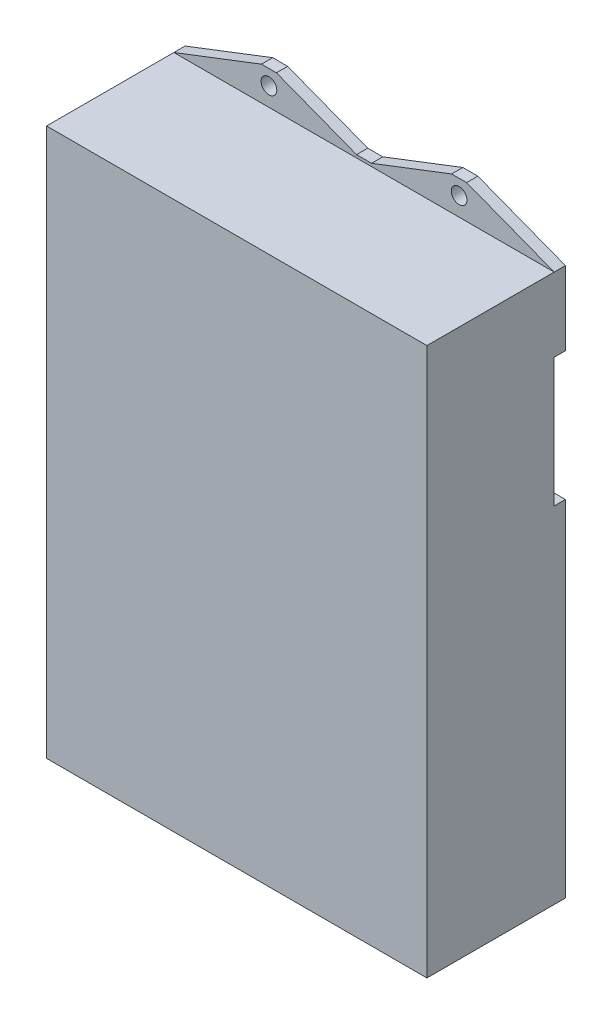
ISO-10303-21;
HEADER;
FILE_DESCRIPTION(('STEP AP214'),'2;1');
FILE_NAME('part.step','',(''),(''),'','','');
FILE_SCHEMA(('AUTOMOTIVE_DESIGN { 1 0 10303 214 1 1 1 1 }'));
ENDSEC;
DATA;
#1=APPLICATION_CONTEXT('core data for automotive mechanical design processes');
#2=APPLICATION_PROTOCOL_DEFINITION('international standard','automotive_design',2000,#1);
#3=PRODUCT_CONTEXT('',#1,'mechanical');
#4=PRODUCT('Part','Part','',(#3));
#5=PRODUCT_RELATED_PRODUCT_CATEGORY('part','',(#4));
#6=PRODUCT_DEFINITION_FORMATION('','',#4);
#7=PRODUCT_DEFINITION_CONTEXT('part definition',#1,'design');
#8=PRODUCT_DEFINITION('design','',#6,#7);
#9=PRODUCT_DEFINITION_SHAPE('','',#8);
#10=(LENGTH_UNIT() NAMED_UNIT(*) SI_UNIT(.MILLI.,.METRE.));
#11=(NAMED_UNIT(*) PLANE_ANGLE_UNIT() SI_UNIT($,.RADIAN.));
#12=(NAMED_UNIT(*) SI_UNIT($,.STERADIAN.) SOLID_ANGLE_UNIT());
#13=UNCERTAINTY_MEASURE_WITH_UNIT(LENGTH_MEASURE(1.E-05),#10,'distance_accuracy_value','');
#14=(GEOMETRIC_REPRESENTATION_CONTEXT(3) GLOBAL_UNCERTAINTY_ASSIGNED_CONTEXT((#13)) GLOBAL_UNIT_ASSIGNED_CONTEXT((#10,
#11,#12)) REPRESENTATION_CONTEXT('',''));
#15=CARTESIAN_POINT('',(0.,0.,0.));
#16=DIRECTION('',(0.,0.,1.));
#17=DIRECTION('',(1.,0.,0.));
#18=AXIS2_PLACEMENT_3D('',#15,#16,#17);
#19=CARTESIAN_POINT('',(0.,0.,3.));
#20=DIRECTION('',(0.,0.,1.));
#21=DIRECTION('',(1.,0.,0.));
#22=AXIS2_PLACEMENT_3D('',#19,#20,#21);
#23=PLANE('',#22);
#24=CARTESIAN_POINT('',(25.4,-78.15,3.));
#25=DIRECTION('',(0.,0.,1.));
#26=DIRECTION('',(-1.,0.,0.));
#27=AXIS2_PLACEMENT_3D('',#24,#25,#26);
#28=CIRCLE('',#27,2.1);
#29=CARTESIAN_POINT('',(23.3,-78.15,3.));
#30=VERTEX_POINT('',#29);
#31=EDGE_CURVE('E497',#30,#30,#28,.T.);
#32=ORIENTED_EDGE('',*,*,#31,.F.);
#33=EDGE_LOOP('',(#32));
#34=FACE_BOUND('',#33,.T.);
#35=CARTESIAN_POINT('',(-25.4,-78.15,3.));
#36=DIRECTION('',(0.,0.,1.));
#37=DIRECTION('',(1.,0.,0.));
#38=AXIS2_PLACEMENT_3D('',#35,#36,#37);
#39=CIRCLE('',#38,2.1);
#40=CARTESIAN_POINT('',(-23.3,-78.15,3.));
#41=VERTEX_POINT('',#40);
#42=EDGE_CURVE('E244',#41,#41,#39,.T.);
#43=ORIENTED_EDGE('',*,*,#42,.F.);
#44=EDGE_LOOP('',(#43));
#45=FACE_BOUND('',#44,.T.);
#46=DIRECTION('',(0.93334560620306,0.358979079308869,0.));
#47=VECTOR('',#46,1.);
#48=CARTESIAN_POINT('',(50.8,-73.15,3.));
#49=LINE('',#48,#47);
#50=CARTESIAN_POINT('',(27.4,-82.15,3.));
#51=VERTEX_POINT('',#50);
#52=CARTESIAN_POINT('',(50.8,-73.15,3.));
#53=VERTEX_POINT('',#52);
#54=EDGE_CURVE('E536',#51,#53,#49,.T.);
#55=ORIENTED_EDGE('',*,*,#54,.T.);
#56=DIRECTION('',(1.,0.,0.));
#57=VECTOR('',#56,1.);
#58=CARTESIAN_POINT('',(-50.8,-73.15,3.));
#59=LINE('',#58,#57);
#60=CARTESIAN_POINT('',(-50.8,-73.15,3.));
#61=VERTEX_POINT('',#60);
#62=EDGE_CURVE('E414',#61,#53,#59,.T.);
#63=ORIENTED_EDGE('',*,*,#62,.F.);
#64=DIRECTION('',(0.93334560620306,-0.358979079308869,0.));
#65=VECTOR('',#64,1.);
#66=CARTESIAN_POINT('',(-50.8,-73.15,3.));
#67=LINE('',#66,#65);
#68=CARTESIAN_POINT('',(-27.4,-82.15,3.));
#69=VERTEX_POINT('',#68);
#70=EDGE_CURVE('E518',#61,#69,#67,.T.);
#71=ORIENTED_EDGE('',*,*,#70,.T.);
#72=DIRECTION('',(1.,0.,0.));
#73=VECTOR('',#72,1.);
#74=CARTESIAN_POINT('',(-27.4,-82.15,3.));
#75=LINE('',#74,#73);
#76=CARTESIAN_POINT('',(-23.4,-82.15,3.));
#77=VERTEX_POINT('',#76);
#78=EDGE_CURVE('E521',#69,#77,#75,.T.);
#79=ORIENTED_EDGE('',*,*,#78,.T.);
#80=DIRECTION('',(0.933345606203059,0.35897907930887,0.));
#81=VECTOR('',#80,1.);
#82=CARTESIAN_POINT('',(-23.4,-82.15,3.));
#83=LINE('',#82,#81);
#84=CARTESIAN_POINT('',(-2.,-73.9192307692308,3.));
#85=VERTEX_POINT('',#84);
#86=EDGE_CURVE('E524',#77,#85,#83,.T.);
#87=ORIENTED_EDGE('',*,*,#86,.T.);
#88=DIRECTION('',(1.,0.,0.));
#89=VECTOR('',#88,1.);
#90=CARTESIAN_POINT('',(-2.,-73.9192307692308,3.));
#91=LINE('',#90,#89);
#92=CARTESIAN_POINT('',(2.,-73.9192307692308,3.));
#93=VERTEX_POINT('',#92);
#94=EDGE_CURVE('E527',#85,#93,#91,.T.);
#95=ORIENTED_EDGE('',*,*,#94,.T.);
#96=DIRECTION('',(0.933345606203059,-0.35897907930887,0.));
#97=VECTOR('',#96,1.);
#98=CARTESIAN_POINT('',(23.4,-82.15,3.));
#99=LINE('',#98,#97);
#100=CARTESIAN_POINT('',(23.4,-82.15,3.));
#101=VERTEX_POINT('',#100);
#102=EDGE_CURVE('E530',#93,#101,#99,.T.);
#103=ORIENTED_EDGE('',*,*,#102,.T.);
#104=DIRECTION('',(1.,0.,0.));
#105=VECTOR('',#104,1.);
#106=CARTESIAN_POINT('',(27.4,-82.15,3.));
#107=LINE('',#106,#105);
#108=EDGE_CURVE('E533',#101,#51,#107,.T.);
#109=ORIENTED_EDGE('',*,*,#108,.T.);
#110=EDGE_LOOP('',(#55,#63,#71,#79,#87,#95,#103,#109));
#111=FACE_BOUND('',#110,.T.);
#112=ADVANCED_FACE('F39',(#34,#45,#111),#23,.T.);
#113=CARTESIAN_POINT('',(25.4,78.15,3.));
#114=DIRECTION('',(0.,0.,1.));
#115=DIRECTION('',(1.,0.,0.));
#116=AXIS2_PLACEMENT_3D('',#113,#114,#115);
#117=CIRCLE('',#116,2.1);
#118=CARTESIAN_POINT('',(27.5,78.15,3.));
#119=VERTEX_POINT('',#118);
#120=EDGE_CURVE('E481',#119,#119,#117,.T.);
#121=ORIENTED_EDGE('',*,*,#120,.F.);
#122=EDGE_LOOP('',(#121));
#123=FACE_BOUND('',#122,.T.);
#124=CARTESIAN_POINT('',(-25.4,78.15,3.));
#125=DIRECTION('',(0.,0.,1.));
#126=DIRECTION('',(-1.,0.,0.));
#127=AXIS2_PLACEMENT_3D('',#124,#125,#126);
#128=CIRCLE('',#127,2.1);
#129=CARTESIAN_POINT('',(-27.5,78.15,3.));
#130=VERTEX_POINT('',#129);
#131=EDGE_CURVE('E489',#130,#130,#128,.T.);
#132=ORIENTED_EDGE('',*,*,#131,.F.);
#133=EDGE_LOOP('',(#132));
#134=FACE_BOUND('',#133,.T.);
#135=DIRECTION('',(-0.93334560620306,-0.358979079308869,0.));
#136=VECTOR('',#135,1.);
#137=CARTESIAN_POINT('',(-50.8,73.15,3.));
#138=LINE('',#137,#136);
#139=CARTESIAN_POINT('',(-27.4,82.15,3.));
#140=VERTEX_POINT('',#139);
#141=CARTESIAN_POINT('',(-50.8,73.15,3.));
#142=VERTEX_POINT('',#141);
#143=EDGE_CURVE('E57',#140,#142,#138,.T.);
#144=ORIENTED_EDGE('',*,*,#143,.T.);
#145=DIRECTION('',(-1.,0.,0.));
#146=VECTOR('',#145,1.);
#147=CARTESIAN_POINT('',(-50.8,73.15,3.));
#148=LINE('',#147,#146);
#149=CARTESIAN_POINT('',(50.8,73.15,3.));
#150=VERTEX_POINT('',#149);
#151=EDGE_CURVE('E427',#150,#142,#148,.T.);
#152=ORIENTED_EDGE('',*,*,#151,.F.);
#153=DIRECTION('',(-0.93334560620306,0.358979079308869,0.));
#154=VECTOR('',#153,1.);
#155=CARTESIAN_POINT('',(50.8,73.15,3.));
#156=LINE('',#155,#154);
#157=CARTESIAN_POINT('',(27.4,82.15,3.));
#158=VERTEX_POINT('',#157);
#159=EDGE_CURVE('E551',#150,#158,#156,.T.);
#160=ORIENTED_EDGE('',*,*,#159,.T.);
#161=DIRECTION('',(-1.,0.,0.));
#162=VECTOR('',#161,1.);
#163=CARTESIAN_POINT('',(27.4,82.15,3.));
#164=LINE('',#163,#162);
#165=CARTESIAN_POINT('',(23.4,82.15,3.));
#166=VERTEX_POINT('',#165);
#167=EDGE_CURVE('E554',#158,#166,#164,.T.);
#168=ORIENTED_EDGE('',*,*,#167,.T.);
#169=DIRECTION('',(-0.933345606203058,-0.358979079308872,0.));
#170=VECTOR('',#169,1.);
#171=CARTESIAN_POINT('',(23.4,82.15,3.));
#172=LINE('',#171,#170);
#173=CARTESIAN_POINT('',(2.,73.9192307692307,3.));
#174=VERTEX_POINT('',#173);
#175=EDGE_CURVE('E557',#166,#174,#172,.T.);
#176=ORIENTED_EDGE('',*,*,#175,.T.);
#177=DIRECTION('',(-1.,0.,0.));
#178=VECTOR('',#177,1.);
#179=CARTESIAN_POINT('',(-1.99999999999982,73.9192307692307,3.));
#180=LINE('',#179,#178);
#181=CARTESIAN_POINT('',(-1.99999999999982,73.9192307692307,3.));
#182=VERTEX_POINT('',#181);
#183=EDGE_CURVE('E217',#174,#182,#180,.T.);
#184=ORIENTED_EDGE('',*,*,#183,.T.);
#185=DIRECTION('',(-0.93334560620306,0.358979079308869,0.));
#186=VECTOR('',#185,1.);
#187=CARTESIAN_POINT('',(-23.4,82.15,3.));
#188=LINE('',#187,#186);
#189=CARTESIAN_POINT('',(-23.4,82.15,3.));
#190=VERTEX_POINT('',#189);
#191=EDGE_CURVE('E211',#182,#190,#188,.T.);
#192=ORIENTED_EDGE('',*,*,#191,.T.);
#193=DIRECTION('',(-1.,0.,0.));
#194=VECTOR('',#193,1.);
#195=CARTESIAN_POINT('',(-27.4,82.15,3.));
#196=LINE('',#195,#194);
#197=EDGE_CURVE('E215',#190,#140,#196,.T.);
#198=ORIENTED_EDGE('',*,*,#197,.T.);
#199=EDGE_LOOP('',(#144,#152,#160,#168,#176,#184,#192,#198));
#200=FACE_BOUND('',#199,.T.);
#201=ADVANCED_FACE('F213',(#123,#134,#200),#23,.T.);
#202=CARTESIAN_POINT('',(0.,0.,0.));
#203=DIRECTION('',(0.,0.,1.));
#204=DIRECTION('',(1.,0.,0.));
#205=AXIS2_PLACEMENT_3D('',#202,#203,#204);
#206=PLANE('',#205);
#207=DIRECTION('',(0.,-1.,0.));
#208=VECTOR('',#207,1.);
#209=CARTESIAN_POINT('',(-50.8,73.15,0.));
#210=LINE('',#209,#208);
#211=CARTESIAN_POINT('',(-50.8,73.15,0.));
#212=VERTEX_POINT('',#211);
#213=CARTESIAN_POINT('',(-50.8,53.45,0.));
#214=VERTEX_POINT('',#213);
#215=EDGE_CURVE('E239',#212,#214,#210,.T.);
#216=ORIENTED_EDGE('',*,*,#215,.F.);
#217=DIRECTION('',(-0.93334560620306,-0.358979079308869,0.));
#218=VECTOR('',#217,1.);
#219=CARTESIAN_POINT('',(-50.8,73.15,0.));
#220=LINE('',#219,#218);
#221=CARTESIAN_POINT('',(-27.4,82.15,0.));
#222=VERTEX_POINT('',#221);
#223=EDGE_CURVE('E141',#222,#212,#220,.T.);
#224=ORIENTED_EDGE('',*,*,#223,.F.);
#225=DIRECTION('',(-1.,0.,0.));
#226=VECTOR('',#225,1.);
#227=CARTESIAN_POINT('',(-27.4,82.15,0.));
#228=LINE('',#227,#226);
#229=CARTESIAN_POINT('',(-23.4,82.15,0.));
#230=VERTEX_POINT('',#229);
#231=EDGE_CURVE('E135',#230,#222,#228,.T.);
#232=ORIENTED_EDGE('',*,*,#231,.F.);
#233=DIRECTION('',(-0.93334560620306,0.358979079308869,0.));
#234=VECTOR('',#233,1.);
#235=CARTESIAN_POINT('',(-23.4,82.15,0.));
#236=LINE('',#235,#234);
#237=CARTESIAN_POINT('',(-1.99999999999982,73.9192307692307,0.));
#238=VERTEX_POINT('',#237);
#239=EDGE_CURVE('E226',#238,#230,#236,.T.);
#240=ORIENTED_EDGE('',*,*,#239,.F.);
#241=DIRECTION('',(-1.,0.,0.));
#242=VECTOR('',#241,1.);
#243=CARTESIAN_POINT('',(-1.99999999999982,73.9192307692307,0.));
#244=LINE('',#243,#242);
#245=CARTESIAN_POINT('',(2.,73.9192307692307,0.));
#246=VERTEX_POINT('',#245);
#247=EDGE_CURVE('E301',#246,#238,#244,.T.);
#248=ORIENTED_EDGE('',*,*,#247,.F.);
#249=DIRECTION('',(-0.933345606203058,-0.358979079308872,0.));
#250=VECTOR('',#249,1.);
#251=CARTESIAN_POINT('',(23.4,82.15,0.));
#252=LINE('',#251,#250);
#253=CARTESIAN_POINT('',(23.4,82.15,0.));
#254=VERTEX_POINT('',#253);
#255=EDGE_CURVE('E298',#254,#246,#252,.T.);
#256=ORIENTED_EDGE('',*,*,#255,.F.);
#257=DIRECTION('',(-1.,0.,0.));
#258=VECTOR('',#257,1.);
#259=CARTESIAN_POINT('',(27.4,82.15,0.));
#260=LINE('',#259,#258);
#261=CARTESIAN_POINT('',(27.4,82.15,0.));
#262=VERTEX_POINT('',#261);
#263=EDGE_CURVE('E295',#262,#254,#260,.T.);
#264=ORIENTED_EDGE('',*,*,#263,.F.);
#265=DIRECTION('',(-0.93334560620306,0.358979079308869,0.));
#266=VECTOR('',#265,1.);
#267=CARTESIAN_POINT('',(50.8,73.15,0.));
#268=LINE('',#267,#266);
#269=CARTESIAN_POINT('',(50.8,73.15,0.));
#270=VERTEX_POINT('',#269);
#271=EDGE_CURVE('E292',#270,#262,#268,.T.);
#272=ORIENTED_EDGE('',*,*,#271,.F.);
#273=DIRECTION('',(0.,1.,0.));
#274=VECTOR('',#273,1.);
#275=CARTESIAN_POINT('',(50.8,73.15,0.));
#276=LINE('',#275,#274);
#277=CARTESIAN_POINT('',(50.8,53.45,0.));
#278=VERTEX_POINT('',#277);
#279=EDGE_CURVE('E289',#278,#270,#276,.T.);
#280=ORIENTED_EDGE('',*,*,#279,.F.);
#281=DIRECTION('',(1.,0.,0.));
#282=VECTOR('',#281,1.);
#283=CARTESIAN_POINT('',(50.8,53.45,0.));
#284=LINE('',#283,#282);
#285=CARTESIAN_POINT('',(43.2,53.45,0.));
#286=VERTEX_POINT('',#285);
#287=EDGE_CURVE('E286',#286,#278,#284,.T.);
#288=ORIENTED_EDGE('',*,*,#287,.F.);
#289=DIRECTION('',(0.,1.,0.));
#290=VECTOR('',#289,1.);
#291=CARTESIAN_POINT('',(43.2,53.45,0.));
#292=LINE('',#291,#290);
#293=CARTESIAN_POINT('',(43.2,19.05,0.));
#294=VERTEX_POINT('',#293);
#295=EDGE_CURVE('E283',#294,#286,#292,.T.);
#296=ORIENTED_EDGE('',*,*,#295,.F.);
#297=DIRECTION('',(-1.,0.,0.));
#298=VECTOR('',#297,1.);
#299=CARTESIAN_POINT('',(43.2,19.05,0.));
#300=LINE('',#299,#298);
#301=CARTESIAN_POINT('',(50.8,19.05,0.));
#302=VERTEX_POINT('',#301);
#303=EDGE_CURVE('E280',#302,#294,#300,.T.);
#304=ORIENTED_EDGE('',*,*,#303,.F.);
#305=DIRECTION('',(0.,1.,0.));
#306=VECTOR('',#305,1.);
#307=CARTESIAN_POINT('',(50.8,19.05,0.));
#308=LINE('',#307,#306);
#309=CARTESIAN_POINT('',(50.8,-73.15,0.));
#310=VERTEX_POINT('',#309);
#311=EDGE_CURVE('E277',#310,#302,#308,.T.);
#312=ORIENTED_EDGE('',*,*,#311,.F.);
#313=DIRECTION('',(0.93334560620306,0.358979079308869,0.));
#314=VECTOR('',#313,1.);
#315=CARTESIAN_POINT('',(50.8,-73.15,0.));
#316=LINE('',#315,#314);
#317=CARTESIAN_POINT('',(27.4,-82.15,0.));
#318=VERTEX_POINT('',#317);
#319=EDGE_CURVE('E274',#318,#310,#316,.T.);
#320=ORIENTED_EDGE('',*,*,#319,.F.);
#321=DIRECTION('',(1.,0.,0.));
#322=VECTOR('',#321,1.);
#323=CARTESIAN_POINT('',(27.4,-82.15,0.));
#324=LINE('',#323,#322);
#325=CARTESIAN_POINT('',(23.4,-82.15,0.));
#326=VERTEX_POINT('',#325);
#327=EDGE_CURVE('E271',#326,#318,#324,.T.);
#328=ORIENTED_EDGE('',*,*,#327,.F.);
#329=DIRECTION('',(0.933345606203059,-0.35897907930887,0.));
#330=VECTOR('',#329,1.);
#331=CARTESIAN_POINT('',(23.4,-82.15,0.));
#332=LINE('',#331,#330);
#333=CARTESIAN_POINT('',(2.,-73.9192307692308,0.));
#334=VERTEX_POINT('',#333);
#335=EDGE_CURVE('E268',#334,#326,#332,.T.);
#336=ORIENTED_EDGE('',*,*,#335,.F.);
#337=DIRECTION('',(1.,0.,0.));
#338=VECTOR('',#337,1.);
#339=CARTESIAN_POINT('',(-2.,-73.9192307692308,0.));
#340=LINE('',#339,#338);
#341=CARTESIAN_POINT('',(-2.,-73.9192307692308,0.));
#342=VERTEX_POINT('',#341);
#343=EDGE_CURVE('E265',#342,#334,#340,.T.);
#344=ORIENTED_EDGE('',*,*,#343,.F.);
#345=DIRECTION('',(0.933345606203059,0.35897907930887,0.));
#346=VECTOR('',#345,1.);
#347=CARTESIAN_POINT('',(-23.4,-82.15,0.));
#348=LINE('',#347,#346);
#349=CARTESIAN_POINT('',(-23.4,-82.15,0.));
#350=VERTEX_POINT('',#349);
#351=EDGE_CURVE('E262',#350,#342,#348,.T.);
#352=ORIENTED_EDGE('',*,*,#351,.F.);
#353=DIRECTION('',(1.,0.,0.));
#354=VECTOR('',#353,1.);
#355=CARTESIAN_POINT('',(-27.4,-82.15,0.));
#356=LINE('',#355,#354);
#357=CARTESIAN_POINT('',(-27.4,-82.15,0.));
#358=VERTEX_POINT('',#357);
#359=EDGE_CURVE('E259',#358,#350,#356,.T.);
#360=ORIENTED_EDGE('',*,*,#359,.F.);
#361=DIRECTION('',(0.93334560620306,-0.358979079308869,0.));
#362=VECTOR('',#361,1.);
#363=CARTESIAN_POINT('',(-50.8,-73.15,0.));
#364=LINE('',#363,#362);
#365=CARTESIAN_POINT('',(-50.8,-73.15,0.));
#366=VERTEX_POINT('',#365);
#367=EDGE_CURVE('E256',#366,#358,#364,.T.);
#368=ORIENTED_EDGE('',*,*,#367,.F.);
#369=DIRECTION('',(0.,-1.,0.));
#370=VECTOR('',#369,1.);
#371=CARTESIAN_POINT('',(-50.8,19.05,0.));
#372=LINE('',#371,#370);
#373=CARTESIAN_POINT('',(-50.8,19.05,0.));
#374=VERTEX_POINT('',#373);
#375=EDGE_CURVE('E253',#374,#366,#372,.T.);
#376=ORIENTED_EDGE('',*,*,#375,.F.);
#377=DIRECTION('',(-1.,0.,0.));
#378=VECTOR('',#377,1.);
#379=CARTESIAN_POINT('',(-50.8,19.05,0.));
#380=LINE('',#379,#378);
#381=CARTESIAN_POINT('',(-43.2,19.05,0.));
#382=VERTEX_POINT('',#381);
#383=EDGE_CURVE('E250',#382,#374,#380,.T.);
#384=ORIENTED_EDGE('',*,*,#383,.F.);
#385=DIRECTION('',(0.,-1.,0.));
#386=VECTOR('',#385,1.);
#387=CARTESIAN_POINT('',(-43.2,53.45,0.));
#388=LINE('',#387,#386);
#389=CARTESIAN_POINT('',(-43.2,53.45,0.));
#390=VERTEX_POINT('',#389);
#391=EDGE_CURVE('E247',#390,#382,#388,.T.);
#392=ORIENTED_EDGE('',*,*,#391,.F.);
#393=DIRECTION('',(1.,0.,0.));
#394=VECTOR('',#393,1.);
#395=CARTESIAN_POINT('',(-50.8,53.45,0.));
#396=LINE('',#395,#394);
#397=EDGE_CURVE('E243',#214,#390,#396,.T.);
#398=ORIENTED_EDGE('',*,*,#397,.F.);
#399=EDGE_LOOP('',(#216,#224,#232,#240,#248,#256,#264,#272,#280,#288,#296,#304,#312,#320,#328,
#336,#344,#352,#360,#368,#376,#384,#392,#398));
#400=FACE_BOUND('',#399,.T.);
#401=CARTESIAN_POINT('',(-25.4,-78.15,0.));
#402=DIRECTION('',(0.,0.,1.));
#403=DIRECTION('',(1.,0.,0.));
#404=AXIS2_PLACEMENT_3D('',#401,#402,#403);
#405=CIRCLE('',#404,2.1);
#406=CARTESIAN_POINT('',(-23.3,-78.15,0.));
#407=VERTEX_POINT('',#406);
#408=EDGE_CURVE('E501',#407,#407,#405,.T.);
#409=ORIENTED_EDGE('',*,*,#408,.T.);
#410=EDGE_LOOP('',(#409));
#411=FACE_BOUND('',#410,.T.);
#412=CARTESIAN_POINT('',(25.4,-78.15,0.));
#413=DIRECTION('',(0.,0.,1.));
#414=DIRECTION('',(-1.,0.,0.));
#415=AXIS2_PLACEMENT_3D('',#412,#413,#414);
#416=CIRCLE('',#415,2.1);
#417=CARTESIAN_POINT('',(23.3,-78.15,0.));
#418=VERTEX_POINT('',#417);
#419=EDGE_CURVE('E493',#418,#418,#416,.T.);
#420=ORIENTED_EDGE('',*,*,#419,.T.);
#421=EDGE_LOOP('',(#420));
#422=FACE_BOUND('',#421,.T.);
#423=CARTESIAN_POINT('',(-25.4,78.15,0.));
#424=DIRECTION('',(0.,0.,1.));
#425=DIRECTION('',(-1.,0.,0.));
#426=AXIS2_PLACEMENT_3D('',#423,#424,#425);
#427=CIRCLE('',#426,2.1);
#428=CARTESIAN_POINT('',(-27.5,78.15,0.));
#429=VERTEX_POINT('',#428);
#430=EDGE_CURVE('E485',#429,#429,#427,.T.);
#431=ORIENTED_EDGE('',*,*,#430,.T.);
#432=EDGE_LOOP('',(#431));
#433=FACE_BOUND('',#432,.T.);
#434=CARTESIAN_POINT('',(25.4,78.15,0.));
#435=DIRECTION('',(0.,0.,1.));
#436=DIRECTION('',(1.,0.,0.));
#437=AXIS2_PLACEMENT_3D('',#434,#435,#436);
#438=CIRCLE('',#437,2.1);
#439=CARTESIAN_POINT('',(27.5,78.15,0.));
#440=VERTEX_POINT('',#439);
#441=EDGE_CURVE('E480',#440,#440,#438,.T.);
#442=ORIENTED_EDGE('',*,*,#441,.T.);
#443=EDGE_LOOP('',(#442));
#444=FACE_BOUND('',#443,.T.);
#445=CARTESIAN_POINT('',(-48.1,-69.85,0.));
#446=DIRECTION('',(0.,0.,1.));
#447=DIRECTION('',(1.,0.,0.));
#448=AXIS2_PLACEMENT_3D('',#445,#446,#447);
#449=CIRCLE('',#448,1.5);
#450=CARTESIAN_POINT('',(-46.6,-69.85,0.));
#451=VERTEX_POINT('',#450);
#452=EDGE_CURVE('E476',#451,#451,#449,.T.);
#453=ORIENTED_EDGE('',*,*,#452,.T.);
#454=EDGE_LOOP('',(#453));
#455=FACE_BOUND('',#454,.T.);
#456=CARTESIAN_POINT('',(48.1,-69.85,0.));
#457=DIRECTION('',(0.,0.,1.));
#458=DIRECTION('',(-1.,0.,0.));
#459=AXIS2_PLACEMENT_3D('',#456,#457,#458);
#460=CIRCLE('',#459,1.5);
#461=CARTESIAN_POINT('',(46.6,-69.85,0.));
#462=VERTEX_POINT('',#461);
#463=EDGE_CURVE('E472',#462,#462,#460,.T.);
#464=ORIENTED_EDGE('',*,*,#463,.T.);
#465=EDGE_LOOP('',(#464));
#466=FACE_BOUND('',#465,.T.);
#467=CARTESIAN_POINT('',(-48.1,69.85,0.));
#468=DIRECTION('',(0.,0.,1.));
#469=DIRECTION('',(-1.,0.,0.));
#470=AXIS2_PLACEMENT_3D('',#467,#468,#469);
#471=CIRCLE('',#470,1.5);
#472=CARTESIAN_POINT('',(-49.6,69.85,0.));
#473=VERTEX_POINT('',#472);
#474=EDGE_CURVE('E468',#473,#473,#471,.T.);
#475=ORIENTED_EDGE('',*,*,#474,.T.);
#476=EDGE_LOOP('',(#475));
#477=FACE_BOUND('',#476,.T.);
#478=CARTESIAN_POINT('',(48.1,69.85,0.));
#479=DIRECTION('',(0.,0.,1.));
#480=DIRECTION('',(1.,0.,0.));
#481=AXIS2_PLACEMENT_3D('',#478,#479,#480);
#482=CIRCLE('',#481,1.5);
#483=CARTESIAN_POINT('',(49.6,69.85,0.));
#484=VERTEX_POINT('',#483);
#485=EDGE_CURVE('E464',#484,#484,#482,.T.);
#486=ORIENTED_EDGE('',*,*,#485,.T.);
#487=EDGE_LOOP('',(#486));
#488=FACE_BOUND('',#487,.T.);
#489=ADVANCED_FACE('F398',(#400,#411,#422,#433,#444,#455,#466,#477,#488),#206,.F.);
#490=CARTESIAN_POINT('',(-50.8,53.45,3.));
#491=DIRECTION('',(0.,1.,0.));
#492=DIRECTION('',(0.,0.,1.));
#493=AXIS2_PLACEMENT_3D('',#490,#491,#492);
#494=PLANE('',#493);
#495=ORIENTED_EDGE('',*,*,#397,.T.);
#496=DIRECTION('',(0.,0.,-1.));
#497=VECTOR('',#496,1.);
#498=CARTESIAN_POINT('',(-43.2,53.45,3.));
#499=LINE('',#498,#497);
#500=CARTESIAN_POINT('',(-43.2,53.45,3.));
#501=VERTEX_POINT('',#500);
#502=EDGE_CURVE('E49',#501,#390,#499,.T.);
#503=ORIENTED_EDGE('',*,*,#502,.F.);
#504=DIRECTION('',(1.,0.,0.));
#505=VECTOR('',#504,1.);
#506=CARTESIAN_POINT('',(-50.8,53.45,3.));
#507=LINE('',#506,#505);
#508=CARTESIAN_POINT('',(-50.8,53.45,3.));
#509=VERTEX_POINT('',#508);
#510=EDGE_CURVE('E149',#509,#501,#507,.T.);
#511=ORIENTED_EDGE('',*,*,#510,.F.);
#512=DIRECTION('',(0.,0.,-1.));
#513=VECTOR('',#512,1.);
#514=CARTESIAN_POINT('',(-50.8,53.45,3.));
#515=LINE('',#514,#513);
#516=EDGE_CURVE('E11',#509,#214,#515,.T.);
#517=ORIENTED_EDGE('',*,*,#516,.T.);
#518=EDGE_LOOP('',(#495,#503,#511,#517));
#519=FACE_BOUND('',#518,.T.);
#520=ADVANCED_FACE('F41',(#519),#494,.F.);
#521=CARTESIAN_POINT('',(-43.2,53.45,3.));
#522=DIRECTION('',(1.,0.,0.));
#523=DIRECTION('',(0.,1.,0.));
#524=AXIS2_PLACEMENT_3D('',#521,#522,#523);
#525=PLANE('',#524);
#526=ORIENTED_EDGE('',*,*,#391,.T.);
#527=DIRECTION('',(0.,0.,-1.));
#528=VECTOR('',#527,1.);
#529=CARTESIAN_POINT('',(-43.2,19.05,3.));
#530=LINE('',#529,#528);
#531=CARTESIAN_POINT('',(-43.2,19.05,3.));
#532=VERTEX_POINT('',#531);
#533=EDGE_CURVE('E384',#532,#382,#530,.T.);
#534=ORIENTED_EDGE('',*,*,#533,.F.);
#535=DIRECTION('',(0.,-1.,0.));
#536=VECTOR('',#535,1.);
#537=CARTESIAN_POINT('',(-43.2,53.45,3.));
#538=LINE('',#537,#536);
#539=EDGE_CURVE('E394',#501,#532,#538,.T.);
#540=ORIENTED_EDGE('',*,*,#539,.F.);
#541=ORIENTED_EDGE('',*,*,#502,.T.);
#542=EDGE_LOOP('',(#526,#534,#540,#541));
#543=FACE_BOUND('',#542,.T.);
#544=ADVANCED_FACE('F392',(#543),#525,.F.);
#545=CARTESIAN_POINT('',(-50.8,19.05,3.));
#546=DIRECTION('',(0.,-1.,0.));
#547=DIRECTION('',(0.,0.,-1.));
#548=AXIS2_PLACEMENT_3D('',#545,#546,#547);
#549=PLANE('',#548);
#550=ORIENTED_EDGE('',*,*,#383,.T.);
#551=DIRECTION('',(0.,0.,-1.));
#552=VECTOR('',#551,1.);
#553=CARTESIAN_POINT('',(-50.8,19.05,3.));
#554=LINE('',#553,#552);
#555=CARTESIAN_POINT('',(-50.8,19.05,3.));
#556=VERTEX_POINT('',#555);
#557=EDGE_CURVE('E380',#556,#374,#554,.T.);
#558=ORIENTED_EDGE('',*,*,#557,.F.);
#559=DIRECTION('',(-1.,0.,0.));
#560=VECTOR('',#559,1.);
#561=CARTESIAN_POINT('',(-50.8,19.05,3.));
#562=LINE('',#561,#560);
#563=EDGE_CURVE('E515',#532,#556,#562,.T.);
#564=ORIENTED_EDGE('',*,*,#563,.F.);
#565=ORIENTED_EDGE('',*,*,#533,.T.);
#566=EDGE_LOOP('',(#550,#558,#564,#565));
#567=FACE_BOUND('',#566,.T.);
#568=ADVANCED_FACE('F403',(#567),#549,.F.);
#569=CARTESIAN_POINT('',(-50.8,19.05,3.));
#570=DIRECTION('',(1.,0.,0.));
#571=DIRECTION('',(0.,0.,-1.));
#572=AXIS2_PLACEMENT_3D('',#569,#570,#571);
#573=PLANE('',#572);
#574=ORIENTED_EDGE('',*,*,#375,.T.);
#575=DIRECTION('',(0.,0.,-1.));
#576=VECTOR('',#575,1.);
#577=CARTESIAN_POINT('',(-50.8,-73.15,3.));
#578=LINE('',#577,#576);
#579=EDGE_CURVE('E376',#61,#366,#578,.T.);
#580=ORIENTED_EDGE('',*,*,#579,.F.);
#581=DIRECTION('',(0.,0.,-1.));
#582=VECTOR('',#581,1.);
#583=CARTESIAN_POINT('',(-50.8,-73.15,37.));
#584=LINE('',#583,#582);
#585=CARTESIAN_POINT('',(-50.8,-73.15,37.));
#586=VERTEX_POINT('',#585);
#587=EDGE_CURVE('E444',#586,#61,#584,.T.);
#588=ORIENTED_EDGE('',*,*,#587,.F.);
#589=DIRECTION('',(0.,-1.,0.));
#590=VECTOR('',#589,1.);
#591=CARTESIAN_POINT('',(-50.8,73.15,37.));
#592=LINE('',#591,#590);
#593=CARTESIAN_POINT('',(-50.8,73.15,37.));
#594=VERTEX_POINT('',#593);
#595=EDGE_CURVE('E431',#594,#586,#592,.T.);
#596=ORIENTED_EDGE('',*,*,#595,.F.);
#597=DIRECTION('',(0.,0.,-1.));
#598=VECTOR('',#597,1.);
#599=CARTESIAN_POINT('',(-50.8,73.15,37.));
#600=LINE('',#599,#598);
#601=EDGE_CURVE('E432',#594,#142,#600,.T.);
#602=ORIENTED_EDGE('',*,*,#601,.T.);
#603=DIRECTION('',(0.,0.,-1.));
#604=VECTOR('',#603,1.);
#605=CARTESIAN_POINT('',(-50.8,73.15,3.));
#606=LINE('',#605,#604);
#607=EDGE_CURVE('E235',#142,#212,#606,.T.);
#608=ORIENTED_EDGE('',*,*,#607,.T.);
#609=ORIENTED_EDGE('',*,*,#215,.T.);
#610=ORIENTED_EDGE('',*,*,#516,.F.);
#611=DIRECTION('',(0.,-1.,0.));
#612=VECTOR('',#611,1.);
#613=CARTESIAN_POINT('',(-50.8,73.15,3.));
#614=LINE('',#613,#612);
#615=EDGE_CURVE('E411',#509,#556,#614,.T.);
#616=ORIENTED_EDGE('',*,*,#615,.T.);
#617=ORIENTED_EDGE('',*,*,#557,.T.);
#618=EDGE_LOOP('',(#574,#580,#588,#596,#602,#608,#609,#610,#616,#617));
#619=FACE_BOUND('',#618,.T.);
#620=ADVANCED_FACE('F408',(#619),#573,.F.);
#621=CARTESIAN_POINT('',(-50.8,-73.15,3.));
#622=DIRECTION('',(0.358979079308869,0.93334560620306,0.));
#623=DIRECTION('',(-0.93334560620306,0.358979079308869,0.));
#624=AXIS2_PLACEMENT_3D('',#621,#622,#623);
#625=PLANE('',#624);
#626=ORIENTED_EDGE('',*,*,#367,.T.);
#627=DIRECTION('',(0.,0.,-1.));
#628=VECTOR('',#627,1.);
#629=CARTESIAN_POINT('',(-27.4,-82.15,3.));
#630=LINE('',#629,#628);
#631=EDGE_CURVE('E372',#69,#358,#630,.T.);
#632=ORIENTED_EDGE('',*,*,#631,.F.);
#633=ORIENTED_EDGE('',*,*,#70,.F.);
#634=ORIENTED_EDGE('',*,*,#579,.T.);
#635=EDGE_LOOP('',(#626,#632,#633,#634));
#636=FACE_BOUND('',#635,.T.);
#637=ADVANCED_FACE('F828',(#636),#625,.F.);
#638=CARTESIAN_POINT('',(-27.4,-82.15,3.));
#639=DIRECTION('',(0.,1.,0.));
#640=DIRECTION('',(0.,0.,1.));
#641=AXIS2_PLACEMENT_3D('',#638,#639,#640);
#642=PLANE('',#641);
#643=ORIENTED_EDGE('',*,*,#359,.T.);
#644=DIRECTION('',(0.,0.,-1.));
#645=VECTOR('',#644,1.);
#646=CARTESIAN_POINT('',(-23.4,-82.15,3.));
#647=LINE('',#646,#645);
#648=EDGE_CURVE('E368',#77,#350,#647,.T.);
#649=ORIENTED_EDGE('',*,*,#648,.F.);
#650=ORIENTED_EDGE('',*,*,#78,.F.);
#651=ORIENTED_EDGE('',*,*,#631,.T.);
#652=EDGE_LOOP('',(#643,#649,#650,#651));
#653=FACE_BOUND('',#652,.T.);
#654=ADVANCED_FACE('F845',(#653),#642,.F.);
#655=CARTESIAN_POINT('',(-23.4,-82.15,3.));
#656=DIRECTION('',(-0.35897907930887,0.933345606203059,0.));
#657=DIRECTION('',(-0.933345606203059,-0.35897907930887,0.));
#658=AXIS2_PLACEMENT_3D('',#655,#656,#657);
#659=PLANE('',#658);
#660=ORIENTED_EDGE('',*,*,#351,.T.);
#661=DIRECTION('',(0.,0.,-1.));
#662=VECTOR('',#661,1.);
#663=CARTESIAN_POINT('',(-2.,-73.9192307692308,3.));
#664=LINE('',#663,#662);
#665=EDGE_CURVE('E364',#85,#342,#664,.T.);
#666=ORIENTED_EDGE('',*,*,#665,.F.);
#667=ORIENTED_EDGE('',*,*,#86,.F.);
#668=ORIENTED_EDGE('',*,*,#648,.T.);
#669=EDGE_LOOP('',(#660,#666,#667,#668));
#670=FACE_BOUND('',#669,.T.);
#671=ADVANCED_FACE('F958',(#670),#659,.F.);
#672=CARTESIAN_POINT('',(-2.,-73.9192307692308,3.));
#673=DIRECTION('',(0.,1.,0.));
#674=DIRECTION('',(0.,0.,1.));
#675=AXIS2_PLACEMENT_3D('',#672,#673,#674);
#676=PLANE('',#675);
#677=ORIENTED_EDGE('',*,*,#343,.T.);
#678=DIRECTION('',(0.,0.,-1.));
#679=VECTOR('',#678,1.);
#680=CARTESIAN_POINT('',(2.,-73.9192307692308,3.));
#681=LINE('',#680,#679);
#682=EDGE_CURVE('E360',#93,#334,#681,.T.);
#683=ORIENTED_EDGE('',*,*,#682,.F.);
#684=ORIENTED_EDGE('',*,*,#94,.F.);
#685=ORIENTED_EDGE('',*,*,#665,.T.);
#686=EDGE_LOOP('',(#677,#683,#684,#685));
#687=FACE_BOUND('',#686,.T.);
#688=ADVANCED_FACE('F962',(#687),#676,.F.);
#689=CARTESIAN_POINT('',(23.4,-82.15,3.));
#690=DIRECTION('',(0.35897907930887,0.933345606203059,0.));
#691=DIRECTION('',(-0.933345606203059,0.35897907930887,0.));
#692=AXIS2_PLACEMENT_3D('',#689,#690,#691);
#693=PLANE('',#692);
#694=ORIENTED_EDGE('',*,*,#335,.T.);
#695=DIRECTION('',(0.,0.,-1.));
#696=VECTOR('',#695,1.);
#697=CARTESIAN_POINT('',(23.4,-82.15,3.));
#698=LINE('',#697,#696);
#699=EDGE_CURVE('E356',#101,#326,#698,.T.);
#700=ORIENTED_EDGE('',*,*,#699,.F.);
#701=ORIENTED_EDGE('',*,*,#102,.F.);
#702=ORIENTED_EDGE('',*,*,#682,.T.);
#703=EDGE_LOOP('',(#694,#700,#701,#702));
#704=FACE_BOUND('',#703,.T.);
#705=ADVANCED_FACE('F966',(#704),#693,.F.);
#706=CARTESIAN_POINT('',(27.4,-82.15,3.));
#707=DIRECTION('',(0.,1.,0.));
#708=DIRECTION('',(0.,0.,1.));
#709=AXIS2_PLACEMENT_3D('',#706,#707,#708);
#710=PLANE('',#709);
#711=ORIENTED_EDGE('',*,*,#327,.T.);
#712=DIRECTION('',(0.,0.,-1.));
#713=VECTOR('',#712,1.);
#714=CARTESIAN_POINT('',(27.4,-82.15,3.));
#715=LINE('',#714,#713);
#716=EDGE_CURVE('E352',#51,#318,#715,.T.);
#717=ORIENTED_EDGE('',*,*,#716,.F.);
#718=ORIENTED_EDGE('',*,*,#108,.F.);
#719=ORIENTED_EDGE('',*,*,#699,.T.);
#720=EDGE_LOOP('',(#711,#717,#718,#719));
#721=FACE_BOUND('',#720,.T.);
#722=ADVANCED_FACE('F859',(#721),#710,.F.);
#723=CARTESIAN_POINT('',(50.8,-73.15,3.));
#724=DIRECTION('',(-0.358979079308869,0.93334560620306,0.));
#725=DIRECTION('',(-0.93334560620306,-0.358979079308869,0.));
#726=AXIS2_PLACEMENT_3D('',#723,#724,#725);
#727=PLANE('',#726);
#728=ORIENTED_EDGE('',*,*,#319,.T.);
#729=DIRECTION('',(0.,0.,-1.));
#730=VECTOR('',#729,1.);
#731=CARTESIAN_POINT('',(50.8,-73.15,3.));
#732=LINE('',#731,#730);
#733=EDGE_CURVE('E348',#53,#310,#732,.T.);
#734=ORIENTED_EDGE('',*,*,#733,.F.);
#735=ORIENTED_EDGE('',*,*,#54,.F.);
#736=ORIENTED_EDGE('',*,*,#716,.T.);
#737=EDGE_LOOP('',(#728,#734,#735,#736));
#738=FACE_BOUND('',#737,.T.);
#739=ADVANCED_FACE('F853',(#738),#727,.F.);
#740=CARTESIAN_POINT('',(43.2,19.05,3.));
#741=DIRECTION('',(0.,-1.,0.));
#742=DIRECTION('',(0.,0.,-1.));
#743=AXIS2_PLACEMENT_3D('',#740,#741,#742);
#744=PLANE('',#743);
#745=ORIENTED_EDGE('',*,*,#303,.T.);
#746=DIRECTION('',(0.,0.,-1.));
#747=VECTOR('',#746,1.);
#748=CARTESIAN_POINT('',(43.2,19.05,3.));
#749=LINE('',#748,#747);
#750=CARTESIAN_POINT('',(43.2,19.05,3.));
#751=VERTEX_POINT('',#750);
#752=EDGE_CURVE('E340',#751,#294,#749,.T.);
#753=ORIENTED_EDGE('',*,*,#752,.F.);
#754=DIRECTION('',(-1.,0.,0.));
#755=VECTOR('',#754,1.);
#756=CARTESIAN_POINT('',(43.2,19.05,3.));
#757=LINE('',#756,#755);
#758=CARTESIAN_POINT('',(50.8,19.05,3.));
#759=VERTEX_POINT('',#758);
#760=EDGE_CURVE('E539',#759,#751,#757,.T.);
#761=ORIENTED_EDGE('',*,*,#760,.F.);
#762=DIRECTION('',(0.,0.,-1.));
#763=VECTOR('',#762,1.);
#764=CARTESIAN_POINT('',(50.8,19.05,3.));
#765=LINE('',#764,#763);
#766=EDGE_CURVE('E344',#759,#302,#765,.T.);
#767=ORIENTED_EDGE('',*,*,#766,.T.);
#768=EDGE_LOOP('',(#745,#753,#761,#767));
#769=FACE_BOUND('',#768,.T.);
#770=ADVANCED_FACE('F858',(#769),#744,.F.);
#771=CARTESIAN_POINT('',(43.2,53.45,3.));
#772=DIRECTION('',(-1.,0.,0.));
#773=DIRECTION('',(0.,-1.,0.));
#774=AXIS2_PLACEMENT_3D('',#771,#772,#773);
#775=PLANE('',#774);
#776=ORIENTED_EDGE('',*,*,#295,.T.);
#777=DIRECTION('',(0.,0.,-1.));
#778=VECTOR('',#777,1.);
#779=CARTESIAN_POINT('',(43.2,53.45,3.));
#780=LINE('',#779,#778);
#781=CARTESIAN_POINT('',(43.2,53.45,3.));
#782=VERTEX_POINT('',#781);
#783=EDGE_CURVE('E336',#782,#286,#780,.T.);
#784=ORIENTED_EDGE('',*,*,#783,.F.);
#785=DIRECTION('',(0.,1.,0.));
#786=VECTOR('',#785,1.);
#787=CARTESIAN_POINT('',(43.2,53.45,3.));
#788=LINE('',#787,#786);
#789=EDGE_CURVE('E543',#751,#782,#788,.T.);
#790=ORIENTED_EDGE('',*,*,#789,.F.);
#791=ORIENTED_EDGE('',*,*,#752,.T.);
#792=EDGE_LOOP('',(#776,#784,#790,#791));
#793=FACE_BOUND('',#792,.T.);
#794=ADVANCED_FACE('F871',(#793),#775,.F.);
#795=CARTESIAN_POINT('',(50.8,53.45,3.));
#796=DIRECTION('',(0.,1.,0.));
#797=DIRECTION('',(0.,0.,1.));
#798=AXIS2_PLACEMENT_3D('',#795,#796,#797);
#799=PLANE('',#798);
#800=ORIENTED_EDGE('',*,*,#287,.T.);
#801=DIRECTION('',(0.,0.,-1.));
#802=VECTOR('',#801,1.);
#803=CARTESIAN_POINT('',(50.8,53.45,3.));
#804=LINE('',#803,#802);
#805=CARTESIAN_POINT('',(50.8,53.45,3.));
#806=VERTEX_POINT('',#805);
#807=EDGE_CURVE('E332',#806,#278,#804,.T.);
#808=ORIENTED_EDGE('',*,*,#807,.F.);
#809=DIRECTION('',(1.,0.,0.));
#810=VECTOR('',#809,1.);
#811=CARTESIAN_POINT('',(50.8,53.45,3.));
#812=LINE('',#811,#810);
#813=EDGE_CURVE('E547',#782,#806,#812,.T.);
#814=ORIENTED_EDGE('',*,*,#813,.F.);
#815=ORIENTED_EDGE('',*,*,#783,.T.);
#816=EDGE_LOOP('',(#800,#808,#814,#815));
#817=FACE_BOUND('',#816,.T.);
#818=ADVANCED_FACE('F623',(#817),#799,.F.);
#819=CARTESIAN_POINT('',(50.8,73.15,3.));
#820=DIRECTION('',(-1.,0.,0.));
#821=DIRECTION('',(0.,-1.,0.));
#822=AXIS2_PLACEMENT_3D('',#819,#820,#821);
#823=PLANE('',#822);
#824=ORIENTED_EDGE('',*,*,#279,.T.);
#825=DIRECTION('',(0.,0.,-1.));
#826=VECTOR('',#825,1.);
#827=CARTESIAN_POINT('',(50.8,73.15,3.));
#828=LINE('',#827,#826);
#829=EDGE_CURVE('E328',#150,#270,#828,.T.);
#830=ORIENTED_EDGE('',*,*,#829,.F.);
#831=DIRECTION('',(0.,0.,-1.));
#832=VECTOR('',#831,1.);
#833=CARTESIAN_POINT('',(50.8,73.15,37.));
#834=LINE('',#833,#832);
#835=CARTESIAN_POINT('',(50.8,73.15,37.));
#836=VERTEX_POINT('',#835);
#837=EDGE_CURVE('E436',#836,#150,#834,.T.);
#838=ORIENTED_EDGE('',*,*,#837,.F.);
#839=DIRECTION('',(0.,1.,0.));
#840=VECTOR('',#839,1.);
#841=CARTESIAN_POINT('',(50.8,73.15,37.));
#842=LINE('',#841,#840);
#843=CARTESIAN_POINT('',(50.8,-73.15,37.));
#844=VERTEX_POINT('',#843);
#845=EDGE_CURVE('E563',#844,#836,#842,.T.);
#846=ORIENTED_EDGE('',*,*,#845,.F.);
#847=DIRECTION('',(0.,0.,-1.));
#848=VECTOR('',#847,1.);
#849=CARTESIAN_POINT('',(50.8,-73.15,37.));
#850=LINE('',#849,#848);
#851=EDGE_CURVE('E440',#844,#53,#850,.T.);
#852=ORIENTED_EDGE('',*,*,#851,.T.);
#853=ORIENTED_EDGE('',*,*,#733,.T.);
#854=ORIENTED_EDGE('',*,*,#311,.T.);
#855=ORIENTED_EDGE('',*,*,#766,.F.);
#856=DIRECTION('',(0.,1.,0.));
#857=VECTOR('',#856,1.);
#858=CARTESIAN_POINT('',(50.8,73.15,3.));
#859=LINE('',#858,#857);
#860=EDGE_CURVE('E418',#759,#806,#859,.T.);
#861=ORIENTED_EDGE('',*,*,#860,.T.);
#862=ORIENTED_EDGE('',*,*,#807,.T.);
#863=EDGE_LOOP('',(#824,#830,#838,#846,#852,#853,#854,#855,#861,#862));
#864=FACE_BOUND('',#863,.T.);
#865=ADVANCED_FACE('F591',(#864),#823,.F.);
#866=CARTESIAN_POINT('',(50.8,73.15,3.));
#867=DIRECTION('',(-0.358979079308869,-0.93334560620306,0.));
#868=DIRECTION('',(0.93334560620306,-0.358979079308869,0.));
#869=AXIS2_PLACEMENT_3D('',#866,#867,#868);
#870=PLANE('',#869);
#871=ORIENTED_EDGE('',*,*,#271,.T.);
#872=DIRECTION('',(0.,0.,-1.));
#873=VECTOR('',#872,1.);
#874=CARTESIAN_POINT('',(27.4,82.15,3.));
#875=LINE('',#874,#873);
#876=EDGE_CURVE('E324',#158,#262,#875,.T.);
#877=ORIENTED_EDGE('',*,*,#876,.F.);
#878=ORIENTED_EDGE('',*,*,#159,.F.);
#879=ORIENTED_EDGE('',*,*,#829,.T.);
#880=EDGE_LOOP('',(#871,#877,#878,#879));
#881=FACE_BOUND('',#880,.T.);
#882=ADVANCED_FACE('F614',(#881),#870,.F.);
#883=CARTESIAN_POINT('',(27.4,82.15,3.));
#884=DIRECTION('',(0.,-1.,0.));
#885=DIRECTION('',(0.,0.,-1.));
#886=AXIS2_PLACEMENT_3D('',#883,#884,#885);
#887=PLANE('',#886);
#888=ORIENTED_EDGE('',*,*,#263,.T.);
#889=DIRECTION('',(0.,0.,-1.));
#890=VECTOR('',#889,1.);
#891=CARTESIAN_POINT('',(23.4,82.15,3.));
#892=LINE('',#891,#890);
#893=EDGE_CURVE('E320',#166,#254,#892,.T.);
#894=ORIENTED_EDGE('',*,*,#893,.F.);
#895=ORIENTED_EDGE('',*,*,#167,.F.);
#896=ORIENTED_EDGE('',*,*,#876,.T.);
#897=EDGE_LOOP('',(#888,#894,#895,#896));
#898=FACE_BOUND('',#897,.T.);
#899=ADVANCED_FACE('F608',(#898),#887,.F.);
#900=CARTESIAN_POINT('',(23.4,82.15,3.));
#901=DIRECTION('',(0.358979079308872,-0.933345606203058,0.));
#902=DIRECTION('',(0.933345606203058,0.358979079308872,0.));
#903=AXIS2_PLACEMENT_3D('',#900,#901,#902);
#904=PLANE('',#903);
#905=ORIENTED_EDGE('',*,*,#255,.T.);
#906=DIRECTION('',(0.,0.,-1.));
#907=VECTOR('',#906,1.);
#908=CARTESIAN_POINT('',(2.,73.9192307692307,3.));
#909=LINE('',#908,#907);
#910=EDGE_CURVE('E316',#174,#246,#909,.T.);
#911=ORIENTED_EDGE('',*,*,#910,.F.);
#912=ORIENTED_EDGE('',*,*,#175,.F.);
#913=ORIENTED_EDGE('',*,*,#893,.T.);
#914=EDGE_LOOP('',(#905,#911,#912,#913));
#915=FACE_BOUND('',#914,.T.);
#916=ADVANCED_FACE('F604',(#915),#904,.F.);
#917=CARTESIAN_POINT('',(-1.99999999999982,73.9192307692307,3.));
#918=DIRECTION('',(0.,-1.,0.));
#919=DIRECTION('',(1.,0.,0.));
#920=AXIS2_PLACEMENT_3D('',#917,#918,#919);
#921=PLANE('',#920);
#922=ORIENTED_EDGE('',*,*,#247,.T.);
#923=DIRECTION('',(0.,0.,-1.));
#924=VECTOR('',#923,1.);
#925=CARTESIAN_POINT('',(-1.99999999999982,73.9192307692307,3.));
#926=LINE('',#925,#924);
#927=EDGE_CURVE('E228',#182,#238,#926,.T.);
#928=ORIENTED_EDGE('',*,*,#927,.F.);
#929=ORIENTED_EDGE('',*,*,#183,.F.);
#930=ORIENTED_EDGE('',*,*,#910,.T.);
#931=EDGE_LOOP('',(#922,#928,#929,#930));
#932=FACE_BOUND('',#931,.T.);
#933=ADVANCED_FACE('F600',(#932),#921,.F.);
#934=CARTESIAN_POINT('',(-23.4,82.15,3.));
#935=DIRECTION('',(-0.358979079308869,-0.933345606203059,0.));
#936=DIRECTION('',(0.93334560620306,-0.358979079308869,0.));
#937=AXIS2_PLACEMENT_3D('',#934,#935,#936);
#938=PLANE('',#937);
#939=ORIENTED_EDGE('',*,*,#239,.T.);
#940=DIRECTION('',(0.,0.,-1.));
#941=VECTOR('',#940,1.);
#942=CARTESIAN_POINT('',(-23.4,82.15,3.));
#943=LINE('',#942,#941);
#944=EDGE_CURVE('E223',#190,#230,#943,.T.);
#945=ORIENTED_EDGE('',*,*,#944,.F.);
#946=ORIENTED_EDGE('',*,*,#191,.F.);
#947=ORIENTED_EDGE('',*,*,#927,.T.);
#948=EDGE_LOOP('',(#939,#945,#946,#947));
#949=FACE_BOUND('',#948,.T.);
#950=ADVANCED_FACE('F224',(#949),#938,.F.);
#951=CARTESIAN_POINT('',(-27.4,82.15,3.));
#952=DIRECTION('',(0.,-1.,0.));
#953=DIRECTION('',(0.,0.,-1.));
#954=AXIS2_PLACEMENT_3D('',#951,#952,#953);
#955=PLANE('',#954);
#956=ORIENTED_EDGE('',*,*,#231,.T.);
#957=DIRECTION('',(0.,0.,-1.));
#958=VECTOR('',#957,1.);
#959=CARTESIAN_POINT('',(-27.4,82.15,3.));
#960=LINE('',#959,#958);
#961=EDGE_CURVE('E229',#140,#222,#960,.T.);
#962=ORIENTED_EDGE('',*,*,#961,.F.);
#963=ORIENTED_EDGE('',*,*,#197,.F.);
#964=ORIENTED_EDGE('',*,*,#944,.T.);
#965=EDGE_LOOP('',(#956,#962,#963,#964));
#966=FACE_BOUND('',#965,.T.);
#967=ADVANCED_FACE('F231',(#966),#955,.F.);
#968=CARTESIAN_POINT('',(-50.8,73.15,3.));
#969=DIRECTION('',(0.358979079308869,-0.93334560620306,0.));
#970=DIRECTION('',(0.93334560620306,0.358979079308869,0.));
#971=AXIS2_PLACEMENT_3D('',#968,#969,#970);
#972=PLANE('',#971);
#973=ORIENTED_EDGE('',*,*,#223,.T.);
#974=ORIENTED_EDGE('',*,*,#607,.F.);
#975=ORIENTED_EDGE('',*,*,#143,.F.);
#976=ORIENTED_EDGE('',*,*,#961,.T.);
#977=EDGE_LOOP('',(#973,#974,#975,#976));
#978=FACE_BOUND('',#977,.T.);
#979=ADVANCED_FACE('F640',(#978),#972,.F.);
#980=CARTESIAN_POINT('',(-25.4,-78.15,3.));
#981=DIRECTION('',(0.,0.,-1.));
#982=DIRECTION('',(-1.,0.,0.));
#983=AXIS2_PLACEMENT_3D('',#980,#981,#982);
#984=CYLINDRICAL_SURFACE('',#983,2.1);
#985=ORIENTED_EDGE('',*,*,#42,.T.);
#986=EDGE_LOOP('',(#985));
#987=FACE_BOUND('',#986,.T.);
#988=ORIENTED_EDGE('',*,*,#408,.F.);
#989=EDGE_LOOP('',(#988));
#990=FACE_BOUND('',#989,.T.);
#991=ADVANCED_FACE('F636',(#987,#990),#984,.F.);
#992=CARTESIAN_POINT('',(25.4,-78.15,3.));
#993=DIRECTION('',(0.,0.,-1.));
#994=DIRECTION('',(-1.,0.,0.));
#995=AXIS2_PLACEMENT_3D('',#992,#993,#994);
#996=CYLINDRICAL_SURFACE('',#995,2.1);
#997=ORIENTED_EDGE('',*,*,#31,.T.);
#998=EDGE_LOOP('',(#997));
#999=FACE_BOUND('',#998,.T.);
#1000=ORIENTED_EDGE('',*,*,#419,.F.);
#1001=EDGE_LOOP('',(#1000));
#1002=FACE_BOUND('',#1001,.T.);
#1003=ADVANCED_FACE('F678',(#999,#1002),#996,.F.);
#1004=CARTESIAN_POINT('',(-25.4,78.15,3.));
#1005=DIRECTION('',(0.,0.,-1.));
#1006=DIRECTION('',(-1.,0.,0.));
#1007=AXIS2_PLACEMENT_3D('',#1004,#1005,#1006);
#1008=CYLINDRICAL_SURFACE('',#1007,2.1);
#1009=ORIENTED_EDGE('',*,*,#131,.T.);
#1010=EDGE_LOOP('',(#1009));
#1011=FACE_BOUND('',#1010,.T.);
#1012=ORIENTED_EDGE('',*,*,#430,.F.);
#1013=EDGE_LOOP('',(#1012));
#1014=FACE_BOUND('',#1013,.T.);
#1015=ADVANCED_FACE('F685',(#1011,#1014),#1008,.F.);
#1016=CARTESIAN_POINT('',(25.4,78.15,3.));
#1017=DIRECTION('',(0.,0.,-1.));
#1018=DIRECTION('',(-1.,0.,0.));
#1019=AXIS2_PLACEMENT_3D('',#1016,#1017,#1018);
#1020=CYLINDRICAL_SURFACE('',#1019,2.1);
#1021=ORIENTED_EDGE('',*,*,#120,.T.);
#1022=EDGE_LOOP('',(#1021));
#1023=FACE_BOUND('',#1022,.T.);
#1024=ORIENTED_EDGE('',*,*,#441,.F.);
#1025=EDGE_LOOP('',(#1024));
#1026=FACE_BOUND('',#1025,.T.);
#1027=ADVANCED_FACE('F692',(#1023,#1026),#1020,.F.);
#1028=CARTESIAN_POINT('',(-48.1,-69.85,3.));
#1029=DIRECTION('',(0.,0.,-1.));
#1030=DIRECTION('',(-1.,0.,0.));
#1031=AXIS2_PLACEMENT_3D('',#1028,#1029,#1030);
#1032=CYLINDRICAL_SURFACE('',#1031,1.5);
#1033=CARTESIAN_POINT('',(-48.1,-69.85,3.));
#1034=DIRECTION('',(0.,0.,1.));
#1035=DIRECTION('',(1.,0.,0.));
#1036=AXIS2_PLACEMENT_3D('',#1033,#1034,#1035);
#1037=CIRCLE('',#1036,1.5);
#1038=CARTESIAN_POINT('',(-46.6,-69.85,3.));
#1039=VERTEX_POINT('',#1038);
#1040=EDGE_CURVE('E460',#1039,#1039,#1037,.T.);
#1041=ORIENTED_EDGE('',*,*,#1040,.T.);
#1042=EDGE_LOOP('',(#1041));
#1043=FACE_BOUND('',#1042,.T.);
#1044=ORIENTED_EDGE('',*,*,#452,.F.);
#1045=EDGE_LOOP('',(#1044));
#1046=FACE_BOUND('',#1045,.T.);
#1047=ADVANCED_FACE('F700',(#1043,#1046),#1032,.F.);
#1048=CARTESIAN_POINT('',(48.1,-69.85,3.));
#1049=DIRECTION('',(0.,0.,-1.));
#1050=DIRECTION('',(-1.,0.,0.));
#1051=AXIS2_PLACEMENT_3D('',#1048,#1049,#1050);
#1052=CYLINDRICAL_SURFACE('',#1051,1.5);
#1053=CARTESIAN_POINT('',(48.1,-69.85,3.));
#1054=DIRECTION('',(0.,0.,1.));
#1055=DIRECTION('',(1.,0.,0.));
#1056=AXIS2_PLACEMENT_3D('',#1053,#1054,#1055);
#1057=CIRCLE('',#1056,1.5);
#1058=CARTESIAN_POINT('',(49.6,-69.85,3.));
#1059=VERTEX_POINT('',#1058);
#1060=EDGE_CURVE('E456',#1059,#1059,#1057,.T.);
#1061=ORIENTED_EDGE('',*,*,#1060,.T.);
#1062=EDGE_LOOP('',(#1061));
#1063=FACE_BOUND('',#1062,.T.);
#1064=ORIENTED_EDGE('',*,*,#463,.F.);
#1065=EDGE_LOOP('',(#1064));
#1066=FACE_BOUND('',#1065,.T.);
#1067=ADVANCED_FACE('F708',(#1063,#1066),#1052,.F.);
#1068=CARTESIAN_POINT('',(-48.1,69.85,3.));
#1069=DIRECTION('',(0.,0.,-1.));
#1070=DIRECTION('',(-1.,0.,0.));
#1071=AXIS2_PLACEMENT_3D('',#1068,#1069,#1070);
#1072=CYLINDRICAL_SURFACE('',#1071,1.5);
#1073=CARTESIAN_POINT('',(-48.1,69.85,3.));
#1074=DIRECTION('',(0.,0.,1.));
#1075=DIRECTION('',(1.,0.,0.));
#1076=AXIS2_PLACEMENT_3D('',#1073,#1074,#1075);
#1077=CIRCLE('',#1076,1.5);
#1078=CARTESIAN_POINT('',(-46.6,69.85,3.));
#1079=VERTEX_POINT('',#1078);
#1080=EDGE_CURVE('E452',#1079,#1079,#1077,.T.);
#1081=ORIENTED_EDGE('',*,*,#1080,.T.);
#1082=EDGE_LOOP('',(#1081));
#1083=FACE_BOUND('',#1082,.T.);
#1084=ORIENTED_EDGE('',*,*,#474,.F.);
#1085=EDGE_LOOP('',(#1084));
#1086=FACE_BOUND('',#1085,.T.);
#1087=ADVANCED_FACE('F716',(#1083,#1086),#1072,.F.);
#1088=CARTESIAN_POINT('',(48.1,69.85,3.));
#1089=DIRECTION('',(0.,0.,-1.));
#1090=DIRECTION('',(-1.,0.,0.));
#1091=AXIS2_PLACEMENT_3D('',#1088,#1089,#1090);
#1092=CYLINDRICAL_SURFACE('',#1091,1.5);
#1093=CARTESIAN_POINT('',(48.1,69.85,3.));
#1094=DIRECTION('',(0.,0.,1.));
#1095=DIRECTION('',(1.,0.,0.));
#1096=AXIS2_PLACEMENT_3D('',#1093,#1094,#1095);
#1097=CIRCLE('',#1096,1.5);
#1098=CARTESIAN_POINT('',(49.6,69.85,3.));
#1099=VERTEX_POINT('',#1098);
#1100=EDGE_CURVE('E448',#1099,#1099,#1097,.T.);
#1101=ORIENTED_EDGE('',*,*,#1100,.T.);
#1102=EDGE_LOOP('',(#1101));
#1103=FACE_BOUND('',#1102,.T.);
#1104=ORIENTED_EDGE('',*,*,#485,.F.);
#1105=EDGE_LOOP('',(#1104));
#1106=FACE_BOUND('',#1105,.T.);
#1107=ADVANCED_FACE('F724',(#1103,#1106),#1092,.F.);
#1108=CARTESIAN_POINT('',(0.,0.,3.));
#1109=DIRECTION('',(0.,0.,1.));
#1110=DIRECTION('',(1.,0.,0.));
#1111=AXIS2_PLACEMENT_3D('',#1108,#1109,#1110);
#1112=PLANE('',#1111);
#1113=ORIENTED_EDGE('',*,*,#1100,.F.);
#1114=EDGE_LOOP('',(#1113));
#1115=FACE_BOUND('',#1114,.T.);
#1116=ADVANCED_FACE('F732',(#1115),#1112,.F.);
#1117=ORIENTED_EDGE('',*,*,#1080,.F.);
#1118=EDGE_LOOP('',(#1117));
#1119=FACE_BOUND('',#1118,.T.);
#1120=ADVANCED_FACE('F739',(#1119),#1112,.F.);
#1121=ORIENTED_EDGE('',*,*,#1060,.F.);
#1122=EDGE_LOOP('',(#1121));
#1123=FACE_BOUND('',#1122,.T.);
#1124=ADVANCED_FACE('F748',(#1123),#1112,.F.);
#1125=ORIENTED_EDGE('',*,*,#1040,.F.);
#1126=EDGE_LOOP('',(#1125));
#1127=FACE_BOUND('',#1126,.T.);
#1128=ADVANCED_FACE('F755',(#1127),#1112,.F.);
#1129=ORIENTED_EDGE('',*,*,#615,.F.);
#1130=ORIENTED_EDGE('',*,*,#510,.T.);
#1131=ORIENTED_EDGE('',*,*,#539,.T.);
#1132=ORIENTED_EDGE('',*,*,#563,.T.);
#1133=EDGE_LOOP('',(#1129,#1130,#1131,#1132));
#1134=FACE_BOUND('',#1133,.T.);
#1135=ADVANCED_FACE('F762',(#1134),#1112,.F.);
#1136=CARTESIAN_POINT('',(-50.8,-73.15,37.));
#1137=DIRECTION('',(0.,1.,0.));
#1138=DIRECTION('',(0.,0.,1.));
#1139=AXIS2_PLACEMENT_3D('',#1136,#1137,#1138);
#1140=PLANE('',#1139);
#1141=ORIENTED_EDGE('',*,*,#62,.T.);
#1142=ORIENTED_EDGE('',*,*,#851,.F.);
#1143=DIRECTION('',(1.,0.,0.));
#1144=VECTOR('',#1143,1.);
#1145=CARTESIAN_POINT('',(-50.8,-73.15,37.));
#1146=LINE('',#1145,#1144);
#1147=EDGE_CURVE('E566',#586,#844,#1146,.T.);
#1148=ORIENTED_EDGE('',*,*,#1147,.F.);
#1149=ORIENTED_EDGE('',*,*,#587,.T.);
#1150=EDGE_LOOP('',(#1141,#1142,#1148,#1149));
#1151=FACE_BOUND('',#1150,.T.);
#1152=ADVANCED_FACE('F585',(#1151),#1140,.F.);
#1153=CARTESIAN_POINT('',(-50.8,73.15,37.));
#1154=DIRECTION('',(0.,-1.,0.));
#1155=DIRECTION('',(0.,0.,-1.));
#1156=AXIS2_PLACEMENT_3D('',#1153,#1154,#1155);
#1157=PLANE('',#1156);
#1158=ORIENTED_EDGE('',*,*,#151,.T.);
#1159=ORIENTED_EDGE('',*,*,#601,.F.);
#1160=DIRECTION('',(-1.,0.,0.));
#1161=VECTOR('',#1160,1.);
#1162=CARTESIAN_POINT('',(-50.8,73.15,37.));
#1163=LINE('',#1162,#1161);
#1164=EDGE_CURVE('E421',#836,#594,#1163,.T.);
#1165=ORIENTED_EDGE('',*,*,#1164,.F.);
#1166=ORIENTED_EDGE('',*,*,#837,.T.);
#1167=EDGE_LOOP('',(#1158,#1159,#1165,#1166));
#1168=FACE_BOUND('',#1167,.T.);
#1169=ADVANCED_FACE('F595',(#1168),#1157,.F.);
#1170=CARTESIAN_POINT('',(0.,0.,37.));
#1171=DIRECTION('',(0.,0.,1.));
#1172=DIRECTION('',(1.,0.,0.));
#1173=AXIS2_PLACEMENT_3D('',#1170,#1171,#1172);
#1174=PLANE('',#1173);
#1175=ORIENTED_EDGE('',*,*,#595,.T.);
#1176=ORIENTED_EDGE('',*,*,#1147,.T.);
#1177=ORIENTED_EDGE('',*,*,#845,.T.);
#1178=ORIENTED_EDGE('',*,*,#1164,.T.);
#1179=EDGE_LOOP('',(#1175,#1176,#1177,#1178));
#1180=FACE_BOUND('',#1179,.T.);
#1181=ADVANCED_FACE('F576',(#1180),#1174,.T.);
#1182=ORIENTED_EDGE('',*,*,#860,.F.);
#1183=ORIENTED_EDGE('',*,*,#760,.T.);
#1184=ORIENTED_EDGE('',*,*,#789,.T.);
#1185=ORIENTED_EDGE('',*,*,#813,.T.);
#1186=EDGE_LOOP('',(#1182,#1183,#1184,#1185));
#1187=FACE_BOUND('',#1186,.T.);
#1188=ADVANCED_FACE('F742',(#1187),#1112,.F.);
#1189=CLOSED_SHELL('',(#112,#201,#489,#520,#544,#568,#620,#637,#654,#671,#688,#705,#722,#739,
#770,#794,#818,#865,#882,#899,#916,#933,#950,#967,#979,#991,#1003,#1015,#1027,#1047,#1067,#1087,
#1107,#1116,#1120,#1124,#1128,#1135,#1152,#1169,#1181,#1188));
#1190=MANIFOLD_SOLID_BREP('B2',#1189);
#1191=ADVANCED_BREP_SHAPE_REPRESENTATION('',(#18,#1190),#14);
#1192=SHAPE_DEFINITION_REPRESENTATION(#9,#1191);
ENDSEC;
END-ISO-10303-21;
